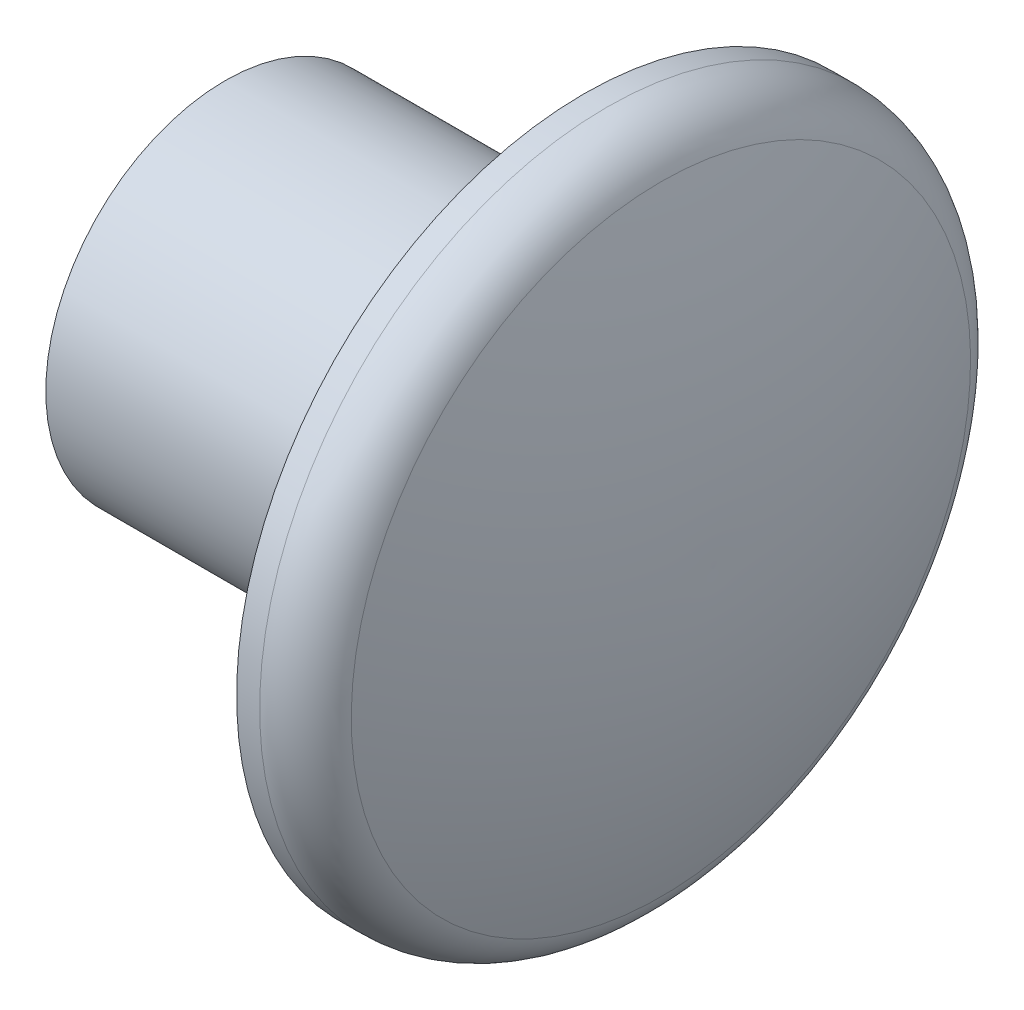
ISO-10303-21;
HEADER;
FILE_DESCRIPTION(('STEP AP214'),'2;1');
FILE_NAME('part.step','',(''),(''),'','','');
FILE_SCHEMA(('AUTOMOTIVE_DESIGN { 1 0 10303 214 1 1 1 1 }'));
ENDSEC;
DATA;
#1=APPLICATION_CONTEXT('core data for automotive mechanical design processes');
#2=APPLICATION_PROTOCOL_DEFINITION('international standard','automotive_design',2000,#1);
#3=PRODUCT_CONTEXT('',#1,'mechanical');
#4=PRODUCT('Part','Part','',(#3));
#5=PRODUCT_RELATED_PRODUCT_CATEGORY('part','',(#4));
#6=PRODUCT_DEFINITION_FORMATION('','',#4);
#7=PRODUCT_DEFINITION_CONTEXT('part definition',#1,'design');
#8=PRODUCT_DEFINITION('design','',#6,#7);
#9=PRODUCT_DEFINITION_SHAPE('','',#8);
#10=(LENGTH_UNIT() NAMED_UNIT(*) SI_UNIT(.MILLI.,.METRE.));
#11=(NAMED_UNIT(*) PLANE_ANGLE_UNIT() SI_UNIT($,.RADIAN.));
#12=(NAMED_UNIT(*) SI_UNIT($,.STERADIAN.) SOLID_ANGLE_UNIT());
#13=UNCERTAINTY_MEASURE_WITH_UNIT(LENGTH_MEASURE(1.E-05),#10,'distance_accuracy_value','');
#14=(GEOMETRIC_REPRESENTATION_CONTEXT(3) GLOBAL_UNCERTAINTY_ASSIGNED_CONTEXT((#13)) GLOBAL_UNIT_ASSIGNED_CONTEXT((#10,
#11,#12)) REPRESENTATION_CONTEXT('',''));
#15=CARTESIAN_POINT('',(0.,0.,0.));
#16=DIRECTION('',(0.,0.,1.));
#17=DIRECTION('',(1.,0.,0.));
#18=AXIS2_PLACEMENT_3D('',#15,#16,#17);
#19=CARTESIAN_POINT('',(45.340458734967,-46.7197863583504,0.));
#20=DIRECTION('',(1.,0.,0.));
#21=DIRECTION('',(0.,1.,0.));
#22=AXIS2_PLACEMENT_3D('',#19,#20,#21);
#23=PLANE('',#22);
#24=CARTESIAN_POINT('',(45.340458734967,-42.7510363583504,0.));
#25=DIRECTION('',(1.,0.,0.));
#26=DIRECTION('',(0.,1.,0.));
#27=AXIS2_PLACEMENT_3D('',#24,#25,#26);
#28=CIRCLE('',#27,3.96875);
#29=CARTESIAN_POINT('',(45.340458734967,-38.7822863583504,0.));
#30=VERTEX_POINT('',#29);
#31=EDGE_CURVE('E63',#30,#30,#28,.T.);
#32=ORIENTED_EDGE('',*,*,#31,.F.);
#33=EDGE_LOOP('',(#32));
#34=FACE_BOUND('',#33,.T.);
#35=ADVANCED_FACE('F34',(#34),#23,.F.);
#36=CARTESIAN_POINT('',(37.0880124389854,-42.4391235472979,0.));
#37=DIRECTION('',(0.,0.,-1.));
#38=DIRECTION('',(0.,1.,0.));
#39=AXIS2_PLACEMENT_3D('',#36,#37,#38);
#40=CIRCLE('',#39,19.05);
#41=TRIMMED_CURVE('',#40,(PARAMETER_VALUE(-1.58717043437417)),
(PARAMETER_VALUE(1.58717043437417)),.T.,.PARAMETER.);
#42=CARTESIAN_POINT('',(37.0880124389854,-42.7510363583504,0.));
#43=DIRECTION('',(1.,0.,0.));
#44=AXIS1_PLACEMENT('',#42,#43);
#45=SURFACE_OF_REVOLUTION('',#41,#44);
#46=CARTESIAN_POINT('',(56.135458734967,-42.7510363583504,0.));
#47=VERTEX_POINT('',#46);
#48=VERTEX_LOOP('',#47);
#49=FACE_BOUND('',#48,.T.);
#50=CARTESIAN_POINT('',(54.980667117183,-42.7510363583504,0.));
#51=DIRECTION('',(1.,0.,0.));
#52=DIRECTION('',(0.,1.,0.));
#53=AXIS2_PLACEMENT_3D('',#50,#51,#52);
#54=CIRCLE('',#53,6.85067481672099);
#55=CARTESIAN_POINT('',(54.980667117183,-35.9003615416294,0.));
#56=VERTEX_POINT('',#55);
#57=EDGE_CURVE('E11',#56,#56,#54,.T.);
#58=ORIENTED_EDGE('',*,*,#57,.T.);
#59=EDGE_LOOP('',(#58));
#60=FACE_BOUND('',#59,.T.);
#61=ADVANCED_FACE('F43',(#49,#60),#45,.T.);
#62=CARTESIAN_POINT('',(53.7878234719699,-42.7510363583504,0.));
#63=DIRECTION('',(1.,0.,0.));
#64=DIRECTION('',(0.,1.,0.));
#65=AXIS2_PLACEMENT_3D('',#62,#63,#64);
#66=TOROIDAL_SURFACE('',#65,6.41475734967643,1.27);
#67=ORIENTED_EDGE('',*,*,#57,.F.);
#68=EDGE_LOOP('',(#67));
#69=FACE_BOUND('',#68,.T.);
#70=CARTESIAN_POINT('',(53.7878234719699,-42.7510363583504,0.));
#71=DIRECTION('',(1.,0.,0.));
#72=DIRECTION('',(0.,1.,0.));
#73=AXIS2_PLACEMENT_3D('',#70,#71,#72);
#74=CIRCLE('',#73,7.68475734967642);
#75=CARTESIAN_POINT('',(53.7878234719699,-35.066279008674,0.));
#76=VERTEX_POINT('',#75);
#77=EDGE_CURVE('E40',#76,#76,#74,.T.);
#78=ORIENTED_EDGE('',*,*,#77,.T.);
#79=EDGE_LOOP('',(#78));
#80=FACE_BOUND('',#79,.T.);
#81=ADVANCED_FACE('F46',(#69,#80),#66,.T.);
#82=CARTESIAN_POINT('',(56.135458734967,-42.7510363583504,0.));
#83=DIRECTION('',(1.,0.,0.));
#84=DIRECTION('',(0.,1.,0.));
#85=AXIS2_PLACEMENT_3D('',#82,#83,#84);
#86=CYLINDRICAL_SURFACE('',#85,7.68475734967642);
#87=ORIENTED_EDGE('',*,*,#77,.F.);
#88=EDGE_LOOP('',(#87));
#89=FACE_BOUND('',#88,.T.);
#90=CARTESIAN_POINT('',(53.277958734967,-42.7510363583504,0.));
#91=DIRECTION('',(1.,0.,0.));
#92=DIRECTION('',(0.,1.,0.));
#93=AXIS2_PLACEMENT_3D('',#90,#91,#92);
#94=CIRCLE('',#93,7.68475734967642);
#95=CARTESIAN_POINT('',(53.277958734967,-35.066279008674,0.));
#96=VERTEX_POINT('',#95);
#97=EDGE_CURVE('E56',#96,#96,#94,.T.);
#98=ORIENTED_EDGE('',*,*,#97,.T.);
#99=EDGE_LOOP('',(#98));
#100=FACE_BOUND('',#99,.T.);
#101=ADVANCED_FACE('F51',(#89,#100),#86,.T.);
#102=CARTESIAN_POINT('',(53.277958734967,-46.7197863583504,0.));
#103=DIRECTION('',(1.,0.,0.));
#104=DIRECTION('',(0.,1.,0.));
#105=AXIS2_PLACEMENT_3D('',#102,#103,#104);
#106=PLANE('',#105);
#107=ORIENTED_EDGE('',*,*,#97,.F.);
#108=EDGE_LOOP('',(#107));
#109=FACE_BOUND('',#108,.T.);
#110=CARTESIAN_POINT('',(53.277958734967,-42.7510363583504,0.));
#111=DIRECTION('',(1.,0.,0.));
#112=DIRECTION('',(0.,1.,0.));
#113=AXIS2_PLACEMENT_3D('',#110,#111,#112);
#114=CIRCLE('',#113,3.96875000000001);
#115=CARTESIAN_POINT('',(53.277958734967,-38.7822863583504,0.));
#116=VERTEX_POINT('',#115);
#117=EDGE_CURVE('E58',#116,#116,#114,.T.);
#118=ORIENTED_EDGE('',*,*,#117,.T.);
#119=EDGE_LOOP('',(#118));
#120=FACE_BOUND('',#119,.T.);
#121=ADVANCED_FACE('F86',(#109,#120),#106,.F.);
#122=CARTESIAN_POINT('',(56.135458734967,-42.7510363583504,0.));
#123=DIRECTION('',(1.,0.,0.));
#124=DIRECTION('',(0.,1.,0.));
#125=AXIS2_PLACEMENT_3D('',#122,#123,#124);
#126=CYLINDRICAL_SURFACE('',#125,3.96875);
#127=ORIENTED_EDGE('',*,*,#117,.F.);
#128=EDGE_LOOP('',(#127));
#129=FACE_BOUND('',#128,.T.);
#130=ORIENTED_EDGE('',*,*,#31,.T.);
#131=EDGE_LOOP('',(#130));
#132=FACE_BOUND('',#131,.T.);
#133=ADVANCED_FACE('F67',(#129,#132),#126,.T.);
#134=CLOSED_SHELL('',(#35,#61,#81,#101,#121,#133));
#135=MANIFOLD_SOLID_BREP('B2',#134);
#136=ADVANCED_BREP_SHAPE_REPRESENTATION('',(#18,#135),#14);
#137=SHAPE_DEFINITION_REPRESENTATION(#9,#136);
ENDSEC;
END-ISO-10303-21;
